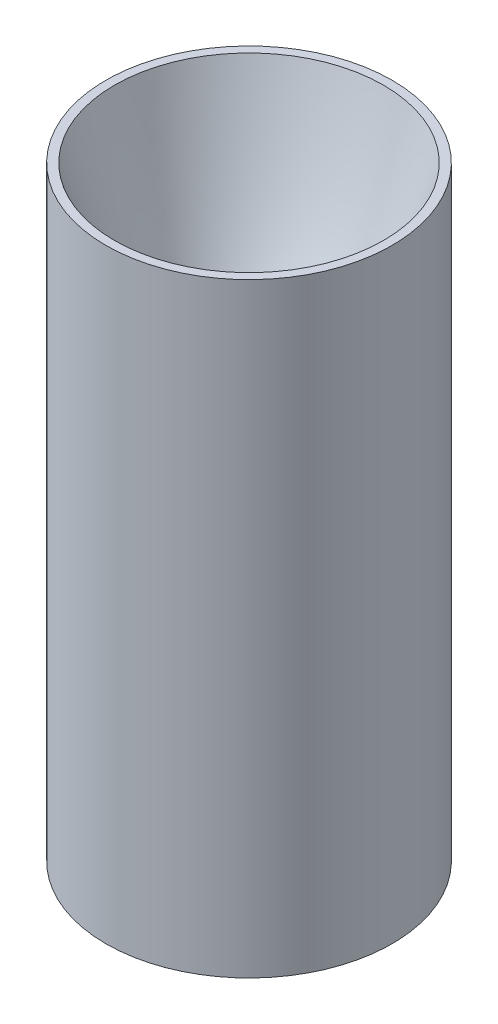
ISO-10303-21;
HEADER;
FILE_DESCRIPTION(('STEP AP214'),'2;1');
FILE_NAME('part.step','',(''),(''),'','','');
FILE_SCHEMA(('AUTOMOTIVE_DESIGN { 1 0 10303 214 1 1 1 1 }'));
ENDSEC;
DATA;
#1=APPLICATION_CONTEXT('core data for automotive mechanical design processes');
#2=APPLICATION_PROTOCOL_DEFINITION('international standard','automotive_design',2000,#1);
#3=PRODUCT_CONTEXT('',#1,'mechanical');
#4=PRODUCT('Part','Part','',(#3));
#5=PRODUCT_RELATED_PRODUCT_CATEGORY('part','',(#4));
#6=PRODUCT_DEFINITION_FORMATION('','',#4);
#7=PRODUCT_DEFINITION_CONTEXT('part definition',#1,'design');
#8=PRODUCT_DEFINITION('design','',#6,#7);
#9=PRODUCT_DEFINITION_SHAPE('','',#8);
#10=(LENGTH_UNIT() NAMED_UNIT(*) SI_UNIT(.MILLI.,.METRE.));
#11=(NAMED_UNIT(*) PLANE_ANGLE_UNIT() SI_UNIT($,.RADIAN.));
#12=(NAMED_UNIT(*) SI_UNIT($,.STERADIAN.) SOLID_ANGLE_UNIT());
#13=UNCERTAINTY_MEASURE_WITH_UNIT(LENGTH_MEASURE(1.E-05),#10,'distance_accuracy_value','');
#14=(GEOMETRIC_REPRESENTATION_CONTEXT(3) GLOBAL_UNCERTAINTY_ASSIGNED_CONTEXT((#13)) GLOBAL_UNIT_ASSIGNED_CONTEXT((#10,
#11,#12)) REPRESENTATION_CONTEXT('',''));
#15=CARTESIAN_POINT('',(0.,0.,0.));
#16=DIRECTION('',(0.,0.,1.));
#17=DIRECTION('',(1.,0.,0.));
#18=AXIS2_PLACEMENT_3D('',#15,#16,#17);
#19=CARTESIAN_POINT('',(26.7062113287053,6.50923965033825,0.));
#20=CARTESIAN_POINT('',(26.6554523867853,6.45847884124841,0.));
#21=CARTESIAN_POINT('',(26.5813741961518,6.38212177902064,0.));
#22=CARTESIAN_POINT('',(26.4154873738352,6.20864164611654,0.));
#23=CARTESIAN_POINT('',(26.2772778817675,6.04995163656635,0.));
#24=CARTESIAN_POINT('',(26.089808500155,5.83291364729743,0.));
#25=CARTESIAN_POINT('',(25.9153376003489,5.61072754276574,0.));
#26=CARTESIAN_POINT('',(25.7027203959471,5.32551893593357,0.));
#27=CARTESIAN_POINT('',(25.5134468469557,5.04570386122365,0.));
#28=CARTESIAN_POINT('',(25.3274206305271,4.75130157548285,0.));
#29=CARTESIAN_POINT('',(25.1569443484507,4.45478312275658,0.));
#30=CARTESIAN_POINT('',(24.995002426509,4.14928218433454,0.));
#31=CARTESIAN_POINT('',(24.8462181027666,3.83966673272222,0.));
#32=CARTESIAN_POINT('',(24.7081288971286,3.52362715719563,0.));
#33=CARTESIAN_POINT('',(24.5825511965105,3.20334704099946,0.));
#34=CARTESIAN_POINT('',(24.4686735390696,2.87809264472723,0.));
#35=CARTESIAN_POINT('',(24.3672556972351,2.54923942069524,0.));
#36=CARTESIAN_POINT('',(24.2780737272776,2.21635441997579,0.));
#37=CARTESIAN_POINT('',(24.2014758273978,1.88099677694374,0.));
#38=CARTESIAN_POINT('',(24.1374314313173,1.54205049780854,0.));
#39=CARTESIAN_POINT('',(24.0861168447955,1.20253727286862,0.));
#40=CARTESIAN_POINT('',(24.0523672130417,0.901433327840423,0.));
#41=CARTESIAN_POINT('',(24.0314657247247,0.646764266269616,0.));
#42=CARTESIAN_POINT('',(24.0193936938296,0.427064117093707,0.));
#43=CARTESIAN_POINT('',(24.0129558487222,0.267641069384235,0.));
#44=CARTESIAN_POINT('',(24.0105384573959,0.11011368951911,0.));
#45=CARTESIAN_POINT('',(24.0100006264442,0.0358926521759333,0.));
#46=CARTESIAN_POINT('',(24.01,1.20494413205813E-13,0.));
#47=B_SPLINE_CURVE_WITH_KNOTS('',4,(#19,#20,#21,#22,#23,#24,#25,#26,#27,#28,#29,#30,#31,#32,#33,
#34,#35,#36,#37,#38,#39,#40,#41,#42,#43,#44,#45,#46),.UNSPECIFIED.,.F.,.F.,(5,1,1,1,1,1,1,1,1,1,
1,1,1,1,1,1,1,1,1,1,1,1,1,1,5),(0.0825688161645696,0.122284452541055,0.142142270729318,
0.162000088917581,0.201715725294151,0.241431361670644,0.281146998047181,0.320862634423759,
0.360578270800262,0.400293907176806,0.440009543553384,0.479725179929891,0.519440816306429,
0.55915645268299,0.598872089059496,0.638587725436031,0.678303361812587,0.718018998189109,
0.75773463456565,0.797450270942201,0.837165907318734,0.857023725507005,0.876881543695275,
0.896739361883545,0.916597180071815),.UNSPECIFIED.);
#48=CARTESIAN_POINT('',(0.,0.,0.));
#49=DIRECTION('',(0.,1.,0.));
#50=AXIS1_PLACEMENT('',#48,#49);
#51=SURFACE_OF_REVOLUTION('',#47,#50);
#52=CARTESIAN_POINT('',(0.,-4.46648731319615E-09,0.));
#53=DIRECTION('',(0.,1.,0.));
#54=DIRECTION('',(0.,0.,1.));
#55=AXIS2_PLACEMENT_3D('',#52,#53,#54);
#56=CIRCLE('',#55,24.0100000000001);
#57=CARTESIAN_POINT('',(0.,-4.46648731319615E-09,24.0100000000001));
#58=VERTEX_POINT('',#57);
#59=EDGE_CURVE('E11',#58,#58,#56,.T.);
#60=ORIENTED_EDGE('',*,*,#59,.F.);
#61=EDGE_LOOP('',(#60));
#62=FACE_BOUND('',#61,.T.);
#63=CARTESIAN_POINT('',(0.,6.50923965033824,0.));
#64=DIRECTION('',(0.,1.,0.));
#65=DIRECTION('',(0.,0.,1.));
#66=AXIS2_PLACEMENT_3D('',#63,#64,#65);
#67=CIRCLE('',#66,26.7062113287053);
#68=CARTESIAN_POINT('',(0.,6.50923965033824,26.7062113287053));
#69=VERTEX_POINT('',#68);
#70=EDGE_CURVE('E146',#69,#69,#67,.T.);
#71=ORIENTED_EDGE('',*,*,#70,.T.);
#72=EDGE_LOOP('',(#71));
#73=FACE_BOUND('',#72,.T.);
#74=ADVANCED_FACE('F39',(#62,#73),#51,.T.);
#75=CARTESIAN_POINT('',(24.0100000000001,-4.46648731319615E-09,0.));
#76=CARTESIAN_POINT('',(24.010001230834,-0.0705286470086049,0.));
#77=CARTESIAN_POINT('',(24.0105303782523,-0.213584189636778,0.));
#78=CARTESIAN_POINT('',(24.0129060640231,-0.543182915830488,0.));
#79=CARTESIAN_POINT('',(24.0192304587046,-0.824160396557403,0.));
#80=CARTESIAN_POINT('',(24.0287155804419,-1.19482207146279,0.));
#81=CARTESIAN_POINT('',(24.0413578738196,-1.51343505805631,0.));
#82=CARTESIAN_POINT('',(24.0571580983374,-1.86193960296647,0.));
#83=CARTESIAN_POINT('',(24.0761133574244,-2.19370687149863,0.));
#84=CARTESIAN_POINT('',(24.1037509723102,-2.61806939963174,0.));
#85=CARTESIAN_POINT('',(24.1432191799184,-3.12203394653439,0.));
#86=CARTESIAN_POINT('',(24.2142318415799,-3.87997867466266,0.));
#87=CARTESIAN_POINT('',(24.3340588147198,-4.88645038796049,0.));
#88=CARTESIAN_POINT('',(24.5104181831735,-6.05671076016822,0.));
#89=CARTESIAN_POINT('',(24.7618173752155,-7.38516641466247,0.));
#90=CARTESIAN_POINT('',(25.0627274585499,-8.70357451439997,0.));
#91=CARTESIAN_POINT('',(25.4127027715297,-10.0096372085356,0.));
#92=CARTESIAN_POINT('',(25.8112931345297,-11.3018195966175,0.));
#93=CARTESIAN_POINT('',(26.2578775457228,-12.5780993348951,0.));
#94=CARTESIAN_POINT('',(26.7519354795231,-13.8368874839743,0.));
#95=CARTESIAN_POINT('',(27.2926052814547,-15.0761971287954,0.));
#96=CARTESIAN_POINT('',(27.8794115489287,-16.2946097938095,0.));
#97=CARTESIAN_POINT('',(28.5110715626963,-17.4899387939621,0.));
#98=CARTESIAN_POINT('',(29.1874645635748,-18.6612877570961,0.));
#99=CARTESIAN_POINT('',(29.906377272164,-19.805743396587,0.));
#100=CARTESIAN_POINT('',(30.6689541722521,-20.9238600748976,0.));
#101=CARTESIAN_POINT('',(31.3700993676047,-21.8744117604426,0.));
#102=CARTESIAN_POINT('',(31.9996682997863,-22.6734454806802,0.));
#103=CARTESIAN_POINT('',(32.5350605946452,-23.3204221384755,0.));
#104=CARTESIAN_POINT('',(32.9831879474879,-23.8400050167798,0.));
#105=CARTESIAN_POINT('',(33.4193822066339,-24.3298162465406,0.));
#106=CARTESIAN_POINT('',(33.8467583028501,-24.788484390126,0.));
#107=CARTESIAN_POINT('',(34.1564908220069,-25.1138683105707,0.));
#108=CARTESIAN_POINT('',(34.4477921404729,-25.4096490472126,0.));
#109=CARTESIAN_POINT('',(34.5473446086514,-25.5099499325014,0.));
#110=CARTESIAN_POINT('',(34.5972149864721,-25.5598221174983,0.));
#111=B_SPLINE_CURVE_WITH_KNOTS('',4,(#75,#76,#77,#78,#79,#80,#81,#82,#83,#84,#85,#86,#87,#88,
#89,#90,#91,#92,#93,#94,#95,#96,#97,#98,#99,#100,#101,#102,#103,#104,#105,#106,#107,#108,#109,
#110),.UNSPECIFIED.,.F.,.F.,(5,1,1,1,1,1,1,1,1,1,1,1,1,1,1,1,1,1,1,1,1,1,1,1,1,1,1,1,1,1,1,1,5),
(0.0826377293599816,0.0925749264345495,0.10251212335078,0.11244932026701,0.122386517183241,
0.132323714099471,0.142260911015702,0.152198107931932,0.162135304848163,0.182009698680624,
0.201884092513085,0.241632880178006,0.281381667842927,0.321130455507848,0.360879243172768,
0.400628030837689,0.44037681850261,0.480125606167531,0.519874393832452,0.559623181497373,
0.599371969162294,0.639120756827214,0.678869544492136,0.718618332157059,0.758367119821983,
0.798115907486907,0.817990301319368,0.837864695151829,0.857739088984291,0.877613482816753,
0.897487876649217,0.907425073565449,0.91736227032105),.UNSPECIFIED.);
#112=CARTESIAN_POINT('',(0.,0.,0.));
#113=DIRECTION('',(0.,1.,0.));
#114=AXIS1_PLACEMENT('',#112,#113);
#115=SURFACE_OF_REVOLUTION('',#111,#114);
#116=CARTESIAN_POINT('',(0.,-25.5598221143495,0.));
#117=DIRECTION('',(0.,1.,0.));
#118=DIRECTION('',(0.,0.,1.));
#119=AXIS2_PLACEMENT_3D('',#116,#117,#118);
#120=CIRCLE('',#119,34.5972149832909);
#121=CARTESIAN_POINT('',(0.,-25.5598221143495,34.5972149832909));
#122=VERTEX_POINT('',#121);
#123=EDGE_CURVE('E47',#122,#122,#120,.T.);
#124=ORIENTED_EDGE('',*,*,#123,.F.);
#125=EDGE_LOOP('',(#124));
#126=FACE_BOUND('',#125,.T.);
#127=ORIENTED_EDGE('',*,*,#59,.T.);
#128=EDGE_LOOP('',(#127));
#129=FACE_BOUND('',#128,.T.);
#130=ADVANCED_FACE('F165',(#126,#129),#115,.T.);
#131=CARTESIAN_POINT('',(0.,-25.5598221143495,0.));
#132=DIRECTION('',(0.,-1.,0.));
#133=DIRECTION('',(0.,0.,-1.));
#134=AXIS2_PLACEMENT_3D('',#131,#132,#133);
#135=CONICAL_SURFACE('',#134,34.5972149832909,0.785398163436918);
#136=CARTESIAN_POINT('',(0.,-34.1674503024594,0.));
#137=DIRECTION('',(0.,1.,0.));
#138=DIRECTION('',(0.,0.,1.));
#139=AXIS2_PLACEMENT_3D('',#136,#137,#138);
#140=CIRCLE('',#139,43.2048431720803);
#141=CARTESIAN_POINT('',(0.,-34.1674503024594,43.2048431720803));
#142=VERTEX_POINT('',#141);
#143=EDGE_CURVE('E223',#142,#142,#140,.T.);
#144=ORIENTED_EDGE('',*,*,#143,.F.);
#145=EDGE_LOOP('',(#144));
#146=FACE_BOUND('',#145,.T.);
#147=ORIENTED_EDGE('',*,*,#123,.T.);
#148=EDGE_LOOP('',(#147));
#149=FACE_BOUND('',#148,.T.);
#150=ADVANCED_FACE('F168',(#146,#149),#135,.F.);
#151=CARTESIAN_POINT('',(43.2048431720803,-34.1674503024594,0.));
#152=CARTESIAN_POINT('',(43.2547153316162,-34.2173227006972,0.));
#153=CARTESIAN_POINT('',(43.3553242540962,-34.3186769321328,0.));
#154=CARTESIAN_POINT('',(43.5850045903309,-34.5517100929211,0.));
#155=CARTESIAN_POINT('',(43.7848568102303,-34.7605007911668,0.));
#156=CARTESIAN_POINT('',(44.0923896922468,-35.084791821967,0.));
#157=CARTESIAN_POINT('',(44.4257083828646,-35.4471532905378,0.));
#158=CARTESIAN_POINT('',(44.8260591459288,-35.8944082618106,0.));
#159=CARTESIAN_POINT('',(45.2637498835705,-36.403541906738,0.));
#160=CARTESIAN_POINT('',(45.8044701470812,-37.0558327415349,0.));
#161=CARTESIAN_POINT('',(46.4308012784225,-37.8516123975977,0.));
#162=CARTESIAN_POINT('',(47.1340343659634,-38.8042368443219,0.));
#163=CARTESIAN_POINT('',(47.8954077591865,-39.9211332544567,0.));
#164=CARTESIAN_POINT('',(48.6150574802605,-41.0663154687782,0.));
#165=CARTESIAN_POINT('',(49.2910524941577,-42.2372538217737,0.));
#166=CARTESIAN_POINT('',(49.9229932037626,-43.4328621021398,0.));
#167=CARTESIAN_POINT('',(50.5096660412486,-44.6511293737381,0.));
#168=CARTESIAN_POINT('',(51.050452662479,-45.8905689699365,0.));
#169=CARTESIAN_POINT('',(51.5444701455753,-47.1492956265149,0.));
#170=CARTESIAN_POINT('',(51.9352810654396,-48.2661297790053,0.));
#171=CARTESIAN_POINT('',(52.2402216765641,-49.2332382924044,0.));
#172=CARTESIAN_POINT('',(52.5209465707137,-50.207649587483,0.));
#173=CARTESIAN_POINT('',(52.7773074768637,-51.1886996300122,0.));
#174=CARTESIAN_POINT('',(53.0029965537757,-52.1776033655984,0.));
#175=CARTESIAN_POINT('',(53.1977431994108,-53.1725857820378,0.));
#176=CARTESIAN_POINT('',(53.3676081739292,-54.1725959707137,0.));
#177=CARTESIAN_POINT('',(53.4883592576744,-55.0083263996009,0.));
#178=CARTESIAN_POINT('',(53.5882208567579,-55.8486409039841,0.));
#179=CARTESIAN_POINT('',(53.6671255351866,-56.6881587025245,0.));
#180=CARTESIAN_POINT('',(53.7113377045683,-57.2811204360298,0.));
#181=CARTESIAN_POINT('',(53.7413500507298,-57.7817549792337,0.));
#182=CARTESIAN_POINT('',(53.7611008829948,-58.2129981581102,0.));
#183=CARTESIAN_POINT('',(53.7737437838757,-58.5327280239111,0.));
#184=CARTESIAN_POINT('',(53.7832292748185,-58.9049560288033,0.));
#185=CARTESIAN_POINT('',(53.7895538765542,-59.1817251525144,0.));
#186=CARTESIAN_POINT('',(53.7919297303013,-59.5155666389604,0.));
#187=CARTESIAN_POINT('',(53.7924588747393,-59.6571436926105,0.));
#188=CARTESIAN_POINT('',(53.7924601068197,-59.7276737457881,0.));
#189=B_SPLINE_CURVE_WITH_KNOTS('',4,(#151,#152,#153,#154,#155,#156,#157,#158,#159,#160,#161,
#162,#163,#164,#165,#166,#167,#168,#169,#170,#171,#172,#173,#174,#175,#176,#177,#178,#179,#180,
#181,#182,#183,#184,#185,#186,#187,#188),.UNSPECIFIED.,.F.,.F.,(5,1,1,1,1,1,1,1,1,1,1,1,1,1,1,1,
1,1,1,1,1,1,1,1,1,1,1,1,1,1,1,1,1,1,5),(0.0826377289384845,0.0925749252793734,0.102512122195606,
0.112449319111838,0.12238651602807,0.142260909860531,0.162135303692992,0.182009697525453,
0.201884091357913,0.241632879022835,0.281381666687757,0.321130454352678,0.3608792420176,
0.400628029682522,0.440376817347443,0.480125605012365,0.519874392677286,0.559623180342207,
0.599371968007128,0.619246361839589,0.639120755672051,0.678869543336972,0.718618331001893,
0.738492724834354,0.758367118666815,0.798115906331736,0.817990300164197,0.837864693996658,
0.857739087829119,0.867676284745349,0.87761348166158,0.88755067857781,0.897487875494041,
0.907425072410271,0.917362269906334),.UNSPECIFIED.);
#190=CARTESIAN_POINT('',(0.,0.,0.));
#191=DIRECTION('',(0.,1.,0.));
#192=AXIS1_PLACEMENT('',#190,#191);
#193=SURFACE_OF_REVOLUTION('',#189,#192);
#194=CARTESIAN_POINT('',(0.,-59.7276737621414,0.));
#195=DIRECTION('',(0.,1.,0.));
#196=DIRECTION('',(0.,0.,1.));
#197=AXIS2_PLACEMENT_3D('',#194,#195,#196);
#198=CIRCLE('',#197,53.79246010682);
#199=CARTESIAN_POINT('',(0.,-59.7276737621414,53.79246010682));
#200=VERTEX_POINT('',#199);
#201=EDGE_CURVE('E220',#200,#200,#198,.T.);
#202=ORIENTED_EDGE('',*,*,#201,.F.);
#203=EDGE_LOOP('',(#202));
#204=FACE_BOUND('',#203,.T.);
#205=ORIENTED_EDGE('',*,*,#143,.T.);
#206=EDGE_LOOP('',(#205));
#207=FACE_BOUND('',#206,.T.);
#208=ADVANCED_FACE('F172',(#204,#207),#193,.T.);
#209=CARTESIAN_POINT('',(0.,0.,0.));
#210=DIRECTION('',(0.,1.,0.));
#211=DIRECTION('',(0.,0.,1.));
#212=AXIS2_PLACEMENT_3D('',#209,#210,#211);
#213=CYLINDRICAL_SURFACE('',#212,53.7924601068201);
#214=CARTESIAN_POINT('',(0.,-212.127673762141,0.));
#215=DIRECTION('',(0.,1.,0.));
#216=DIRECTION('',(0.,0.,1.));
#217=AXIS2_PLACEMENT_3D('',#214,#215,#216);
#218=CIRCLE('',#217,53.7924601068201);
#219=CARTESIAN_POINT('',(0.,-212.127673762141,53.7924601068201));
#220=VERTEX_POINT('',#219);
#221=EDGE_CURVE('E217',#220,#220,#218,.T.);
#222=ORIENTED_EDGE('',*,*,#221,.F.);
#223=EDGE_LOOP('',(#222));
#224=FACE_BOUND('',#223,.T.);
#225=ORIENTED_EDGE('',*,*,#201,.T.);
#226=EDGE_LOOP('',(#225));
#227=FACE_BOUND('',#226,.T.);
#228=ADVANCED_FACE('F176',(#224,#227),#213,.F.);
#229=CARTESIAN_POINT('',(76.2,-212.127673762141,0.));
#230=DIRECTION('',(0.,1.,0.));
#231=DIRECTION('',(0.,0.,1.));
#232=AXIS2_PLACEMENT_3D('',#229,#230,#231);
#233=PLANE('',#232);
#234=CARTESIAN_POINT('',(-61.59966783019,-212.127673762141,25.5154178529424));
#235=DIRECTION('',(0.,-1.,0.));
#236=DIRECTION('',(0.,0.,-1.));
#237=AXIS2_PLACEMENT_3D('',#234,#235,#236);
#238=CIRCLE('',#237,3.17499999999999);
#239=CARTESIAN_POINT('',(-61.59966783019,-212.127673762141,22.3404178529424));
#240=VERTEX_POINT('',#239);
#241=EDGE_CURVE('E89',#240,#240,#238,.T.);
#242=ORIENTED_EDGE('',*,*,#241,.F.);
#243=EDGE_LOOP('',(#242));
#244=FACE_BOUND('',#243,.T.);
#245=CARTESIAN_POINT('',(61.59966783019,-212.127673762141,-25.5154178529424));
#246=DIRECTION('',(0.,-1.,0.));
#247=DIRECTION('',(0.,0.,-1.));
#248=AXIS2_PLACEMENT_3D('',#245,#246,#247);
#249=CIRCLE('',#248,3.17499999999998);
#250=CARTESIAN_POINT('',(61.59966783019,-212.127673762141,-28.6904178529424));
#251=VERTEX_POINT('',#250);
#252=EDGE_CURVE('E88',#251,#251,#249,.T.);
#253=ORIENTED_EDGE('',*,*,#252,.F.);
#254=EDGE_LOOP('',(#253));
#255=FACE_BOUND('',#254,.T.);
#256=CARTESIAN_POINT('',(47.1463446356136,-212.127673762141,47.1463446356125));
#257=DIRECTION('',(0.,-1.,0.));
#258=DIRECTION('',(0.,0.,-1.));
#259=AXIS2_PLACEMENT_3D('',#256,#257,#258);
#260=CIRCLE('',#259,4.21639999999999);
#261=CARTESIAN_POINT('',(47.1463446356136,-212.127673762141,42.9299446356125));
#262=VERTEX_POINT('',#261);
#263=EDGE_CURVE('E99',#262,#262,#260,.T.);
#264=ORIENTED_EDGE('',*,*,#263,.F.);
#265=EDGE_LOOP('',(#264));
#266=FACE_BOUND('',#265,.T.);
#267=CARTESIAN_POINT('',(6.98383554802098E-13,-212.127673762141,66.675));
#268=DIRECTION('',(0.,-1.,0.));
#269=DIRECTION('',(0.,0.,-1.));
#270=AXIS2_PLACEMENT_3D('',#267,#268,#269);
#271=CIRCLE('',#270,4.21639999999999);
#272=CARTESIAN_POINT('',(6.98383554802098E-13,-212.127673762141,62.4586));
#273=VERTEX_POINT('',#272);
#274=EDGE_CURVE('E105',#273,#273,#271,.T.);
#275=ORIENTED_EDGE('',*,*,#274,.F.);
#276=EDGE_LOOP('',(#275));
#277=FACE_BOUND('',#276,.T.);
#278=CARTESIAN_POINT('',(-47.1463446356126,-212.127673762141,47.1463446356135));
#279=DIRECTION('',(0.,-1.,0.));
#280=DIRECTION('',(0.,0.,-1.));
#281=AXIS2_PLACEMENT_3D('',#278,#279,#280);
#282=CIRCLE('',#281,4.21639999999999);
#283=CARTESIAN_POINT('',(-47.1463446356126,-212.127673762141,42.9299446356135));
#284=VERTEX_POINT('',#283);
#285=EDGE_CURVE('E111',#284,#284,#282,.T.);
#286=ORIENTED_EDGE('',*,*,#285,.F.);
#287=EDGE_LOOP('',(#286));
#288=FACE_BOUND('',#287,.T.);
#289=CARTESIAN_POINT('',(-66.675,-212.127673762141,0.));
#290=DIRECTION('',(0.,-1.,0.));
#291=DIRECTION('',(0.,0.,-1.));
#292=AXIS2_PLACEMENT_3D('',#289,#290,#291);
#293=CIRCLE('',#292,4.21639999999999);
#294=CARTESIAN_POINT('',(-66.675,-212.127673762141,-4.21639999999999));
#295=VERTEX_POINT('',#294);
#296=EDGE_CURVE('E117',#295,#295,#293,.T.);
#297=ORIENTED_EDGE('',*,*,#296,.F.);
#298=EDGE_LOOP('',(#297));
#299=FACE_BOUND('',#298,.T.);
#300=CARTESIAN_POINT('',(-47.1463446356133,-212.127673762141,-47.1463446356128));
#301=DIRECTION('',(0.,-1.,0.));
#302=DIRECTION('',(0.,0.,-1.));
#303=AXIS2_PLACEMENT_3D('',#300,#301,#302);
#304=CIRCLE('',#303,4.21639999999999);
#305=CARTESIAN_POINT('',(-47.1463446356133,-212.127673762141,-51.3627446356128));
#306=VERTEX_POINT('',#305);
#307=EDGE_CURVE('E123',#306,#306,#304,.T.);
#308=ORIENTED_EDGE('',*,*,#307,.F.);
#309=EDGE_LOOP('',(#308));
#310=FACE_BOUND('',#309,.T.);
#311=CARTESIAN_POINT('',(-2.32794518267366E-13,-212.127673762141,-66.675));
#312=DIRECTION('',(0.,-1.,0.));
#313=DIRECTION('',(0.,0.,-1.));
#314=AXIS2_PLACEMENT_3D('',#311,#312,#313);
#315=CIRCLE('',#314,4.21639999999999);
#316=CARTESIAN_POINT('',(-2.32794518267366E-13,-212.127673762141,-70.8914));
#317=VERTEX_POINT('',#316);
#318=EDGE_CURVE('E129',#317,#317,#315,.T.);
#319=ORIENTED_EDGE('',*,*,#318,.F.);
#320=EDGE_LOOP('',(#319));
#321=FACE_BOUND('',#320,.T.);
#322=CARTESIAN_POINT('',(47.146344635613,-212.127673762141,-47.1463446356132));
#323=DIRECTION('',(0.,-1.,0.));
#324=DIRECTION('',(0.,0.,-1.));
#325=AXIS2_PLACEMENT_3D('',#322,#323,#324);
#326=CIRCLE('',#325,4.21639999999999);
#327=CARTESIAN_POINT('',(47.146344635613,-212.127673762141,-51.3627446356131));
#328=VERTEX_POINT('',#327);
#329=EDGE_CURVE('E135',#328,#328,#326,.T.);
#330=ORIENTED_EDGE('',*,*,#329,.F.);
#331=EDGE_LOOP('',(#330));
#332=FACE_BOUND('',#331,.T.);
#333=CARTESIAN_POINT('',(66.675,-212.127673762141,0.));
#334=DIRECTION('',(0.,-1.,0.));
#335=DIRECTION('',(0.,0.,-1.));
#336=AXIS2_PLACEMENT_3D('',#333,#334,#335);
#337=CIRCLE('',#336,4.21639999999999);
#338=CARTESIAN_POINT('',(66.675,-212.127673762141,-4.21639999999999));
#339=VERTEX_POINT('',#338);
#340=EDGE_CURVE('E141',#339,#339,#337,.T.);
#341=ORIENTED_EDGE('',*,*,#340,.F.);
#342=EDGE_LOOP('',(#341));
#343=FACE_BOUND('',#342,.T.);
#344=CARTESIAN_POINT('',(0.,-212.127673762141,0.));
#345=DIRECTION('',(0.,1.,0.));
#346=DIRECTION('',(0.,0.,1.));
#347=AXIS2_PLACEMENT_3D('',#344,#345,#346);
#348=CIRCLE('',#347,76.2);
#349=CARTESIAN_POINT('',(0.,-212.127673762141,76.2));
#350=VERTEX_POINT('',#349);
#351=EDGE_CURVE('E214',#350,#350,#348,.T.);
#352=ORIENTED_EDGE('',*,*,#351,.F.);
#353=EDGE_LOOP('',(#352));
#354=FACE_BOUND('',#353,.T.);
#355=ORIENTED_EDGE('',*,*,#221,.T.);
#356=EDGE_LOOP('',(#355));
#357=FACE_BOUND('',#356,.T.);
#358=ADVANCED_FACE('F180',(#244,#255,#266,#277,#288,#299,#310,#321,#332,#343,#354,#357),#233,.F.);
#359=CARTESIAN_POINT('',(0.,0.,0.));
#360=DIRECTION('',(0.,1.,0.));
#361=DIRECTION('',(0.,0.,1.));
#362=AXIS2_PLACEMENT_3D('',#359,#360,#361);
#363=CYLINDRICAL_SURFACE('',#362,76.2);
#364=CARTESIAN_POINT('',(0.,109.927347076635,0.));
#365=DIRECTION('',(0.,1.,0.));
#366=DIRECTION('',(0.,0.,1.));
#367=AXIS2_PLACEMENT_3D('',#364,#365,#366);
#368=CIRCLE('',#367,76.2);
#369=CARTESIAN_POINT('',(0.,109.927347076635,76.2));
#370=VERTEX_POINT('',#369);
#371=EDGE_CURVE('E211',#370,#370,#368,.T.);
#372=ORIENTED_EDGE('',*,*,#371,.F.);
#373=EDGE_LOOP('',(#372));
#374=FACE_BOUND('',#373,.T.);
#375=ORIENTED_EDGE('',*,*,#351,.T.);
#376=EDGE_LOOP('',(#375));
#377=FACE_BOUND('',#376,.T.);
#378=ADVANCED_FACE('F184',(#374,#377),#363,.T.);
#379=CARTESIAN_POINT('',(71.6384554787615,109.927347076635,0.));
#380=DIRECTION('',(0.,-1.,0.));
#381=DIRECTION('',(0.,0.,-1.));
#382=AXIS2_PLACEMENT_3D('',#379,#380,#381);
#383=PLANE('',#382);
#384=CARTESIAN_POINT('',(0.,109.927347076635,0.));
#385=DIRECTION('',(0.,1.,0.));
#386=DIRECTION('',(0.,0.,1.));
#387=AXIS2_PLACEMENT_3D('',#384,#385,#386);
#388=CIRCLE('',#387,71.6384554787615);
#389=CARTESIAN_POINT('',(0.,109.927347076635,71.6384554787615));
#390=VERTEX_POINT('',#389);
#391=EDGE_CURVE('E208',#390,#390,#388,.T.);
#392=ORIENTED_EDGE('',*,*,#391,.F.);
#393=EDGE_LOOP('',(#392));
#394=FACE_BOUND('',#393,.T.);
#395=ORIENTED_EDGE('',*,*,#371,.T.);
#396=EDGE_LOOP('',(#395));
#397=FACE_BOUND('',#396,.T.);
#398=ADVANCED_FACE('F188',(#394,#397),#383,.F.);
#399=CARTESIAN_POINT('',(71.6384554787615,109.927347076635,0.));
#400=CARTESIAN_POINT('',(49.1723334607279,34.6359542236987,0.));
#401=CARTESIAN_POINT('',(26.7062113287053,6.50923965033824,0.));
#402=B_SPLINE_CURVE_WITH_KNOTS('',2,(#399,#400,#401),.UNSPECIFIED.,.F.,.F.,(3,3),(0.,1.),.UNSPECIFIED.);
#403=CARTESIAN_POINT('',(0.,0.,0.));
#404=DIRECTION('',(0.,1.,0.));
#405=AXIS1_PLACEMENT('',#403,#404);
#406=SURFACE_OF_REVOLUTION('',#402,#405);
#407=ORIENTED_EDGE('',*,*,#70,.F.);
#408=EDGE_LOOP('',(#407));
#409=FACE_BOUND('',#408,.T.);
#410=ORIENTED_EDGE('',*,*,#391,.T.);
#411=EDGE_LOOP('',(#410));
#412=FACE_BOUND('',#411,.T.);
#413=ADVANCED_FACE('F192',(#409,#412),#406,.T.);
#414=CARTESIAN_POINT('',(66.675,-187.126453762141,0.));
#415=DIRECTION('',(0.,-1.,0.));
#416=DIRECTION('',(0.,0.,-1.));
#417=AXIS2_PLACEMENT_3D('',#414,#415,#416);
#418=CONICAL_SURFACE('',#417,4.21639999999999,1.02974425867665);
#419=CARTESIAN_POINT('',(66.675,-184.592985048074,0.));
#420=VERTEX_POINT('',#419);
#421=VERTEX_LOOP('',#420);
#422=FACE_BOUND('',#421,.T.);
#423=CARTESIAN_POINT('',(66.675,-187.126453762141,0.));
#424=DIRECTION('',(0.,-1.,0.));
#425=DIRECTION('',(0.,0.,-1.));
#426=AXIS2_PLACEMENT_3D('',#423,#424,#425);
#427=CIRCLE('',#426,4.21639999999999);
#428=CARTESIAN_POINT('',(66.675,-187.126453762141,-4.21639999999999));
#429=VERTEX_POINT('',#428);
#430=EDGE_CURVE('E144',#429,#429,#427,.T.);
#431=ORIENTED_EDGE('',*,*,#430,.T.);
#432=EDGE_LOOP('',(#431));
#433=FACE_BOUND('',#432,.T.);
#434=ADVANCED_FACE('F196',(#422,#433),#418,.F.);
#435=CARTESIAN_POINT('',(66.675,-212.127673762141,0.));
#436=DIRECTION('',(0.,-1.,0.));
#437=DIRECTION('',(0.,0.,-1.));
#438=AXIS2_PLACEMENT_3D('',#435,#436,#437);
#439=CYLINDRICAL_SURFACE('',#438,4.21639999999999);
#440=ORIENTED_EDGE('',*,*,#430,.F.);
#441=EDGE_LOOP('',(#440));
#442=FACE_BOUND('',#441,.T.);
#443=ORIENTED_EDGE('',*,*,#340,.T.);
#444=EDGE_LOOP('',(#443));
#445=FACE_BOUND('',#444,.T.);
#446=ADVANCED_FACE('F289',(#442,#445),#439,.F.);
#447=CARTESIAN_POINT('',(47.146344635613,-187.126453762141,-47.1463446356132));
#448=DIRECTION('',(0.,-1.,0.));
#449=DIRECTION('',(0.,0.,-1.));
#450=AXIS2_PLACEMENT_3D('',#447,#448,#449);
#451=CONICAL_SURFACE('',#450,4.21639999999999,1.02974425867665);
#452=CARTESIAN_POINT('',(47.146344635613,-184.592985048074,-47.1463446356132));
#453=VERTEX_POINT('',#452);
#454=VERTEX_LOOP('',#453);
#455=FACE_BOUND('',#454,.T.);
#456=CARTESIAN_POINT('',(47.146344635613,-187.126453762141,-47.1463446356132));
#457=DIRECTION('',(0.,-1.,0.));
#458=DIRECTION('',(0.,0.,-1.));
#459=AXIS2_PLACEMENT_3D('',#456,#457,#458);
#460=CIRCLE('',#459,4.21639999999999);
#461=CARTESIAN_POINT('',(47.146344635613,-187.126453762141,-51.3627446356131));
#462=VERTEX_POINT('',#461);
#463=EDGE_CURVE('E138',#462,#462,#460,.T.);
#464=ORIENTED_EDGE('',*,*,#463,.T.);
#465=EDGE_LOOP('',(#464));
#466=FACE_BOUND('',#465,.T.);
#467=ADVANCED_FACE('F296',(#455,#466),#451,.F.);
#468=CARTESIAN_POINT('',(47.146344635613,-212.127673762141,-47.1463446356132));
#469=DIRECTION('',(0.,-1.,0.));
#470=DIRECTION('',(0.,0.,-1.));
#471=AXIS2_PLACEMENT_3D('',#468,#469,#470);
#472=CYLINDRICAL_SURFACE('',#471,4.21639999999999);
#473=ORIENTED_EDGE('',*,*,#463,.F.);
#474=EDGE_LOOP('',(#473));
#475=FACE_BOUND('',#474,.T.);
#476=ORIENTED_EDGE('',*,*,#329,.T.);
#477=EDGE_LOOP('',(#476));
#478=FACE_BOUND('',#477,.T.);
#479=ADVANCED_FACE('F304',(#475,#478),#472,.F.);
#480=CARTESIAN_POINT('',(-2.32794518267366E-13,-187.126453762141,-66.675));
#481=DIRECTION('',(0.,-1.,0.));
#482=DIRECTION('',(0.,0.,-1.));
#483=AXIS2_PLACEMENT_3D('',#480,#481,#482);
#484=CONICAL_SURFACE('',#483,4.21639999999999,1.02974425867665);
#485=CARTESIAN_POINT('',(-2.39538571947206E-13,-184.592985048074,-66.675));
#486=VERTEX_POINT('',#485);
#487=VERTEX_LOOP('',#486);
#488=FACE_BOUND('',#487,.T.);
#489=CARTESIAN_POINT('',(-2.32794518267366E-13,-187.126453762141,-66.675));
#490=DIRECTION('',(0.,-1.,0.));
#491=DIRECTION('',(0.,0.,-1.));
#492=AXIS2_PLACEMENT_3D('',#489,#490,#491);
#493=CIRCLE('',#492,4.21639999999999);
#494=CARTESIAN_POINT('',(-2.32794518267366E-13,-187.126453762141,-70.8914));
#495=VERTEX_POINT('',#494);
#496=EDGE_CURVE('E132',#495,#495,#493,.T.);
#497=ORIENTED_EDGE('',*,*,#496,.T.);
#498=EDGE_LOOP('',(#497));
#499=FACE_BOUND('',#498,.T.);
#500=ADVANCED_FACE('F312',(#488,#499),#484,.F.);
#501=CARTESIAN_POINT('',(-2.32794518267366E-13,-212.127673762141,-66.675));
#502=DIRECTION('',(0.,-1.,0.));
#503=DIRECTION('',(0.,0.,-1.));
#504=AXIS2_PLACEMENT_3D('',#501,#502,#503);
#505=CYLINDRICAL_SURFACE('',#504,4.21639999999999);
#506=ORIENTED_EDGE('',*,*,#496,.F.);
#507=EDGE_LOOP('',(#506));
#508=FACE_BOUND('',#507,.T.);
#509=ORIENTED_EDGE('',*,*,#318,.T.);
#510=EDGE_LOOP('',(#509));
#511=FACE_BOUND('',#510,.T.);
#512=ADVANCED_FACE('F321',(#508,#511),#505,.F.);
#513=CARTESIAN_POINT('',(-47.1463446356133,-187.126453762141,-47.1463446356128));
#514=DIRECTION('',(0.,-1.,0.));
#515=DIRECTION('',(0.,0.,-1.));
#516=AXIS2_PLACEMENT_3D('',#513,#514,#515);
#517=CONICAL_SURFACE('',#516,4.21639999999999,1.02974425867665);
#518=CARTESIAN_POINT('',(-47.1463446356133,-184.592985048074,-47.1463446356128));
#519=VERTEX_POINT('',#518);
#520=VERTEX_LOOP('',#519);
#521=FACE_BOUND('',#520,.T.);
#522=CARTESIAN_POINT('',(-47.1463446356133,-187.126453762141,-47.1463446356128));
#523=DIRECTION('',(0.,-1.,0.));
#524=DIRECTION('',(0.,0.,-1.));
#525=AXIS2_PLACEMENT_3D('',#522,#523,#524);
#526=CIRCLE('',#525,4.21639999999999);
#527=CARTESIAN_POINT('',(-47.1463446356133,-187.126453762141,-51.3627446356128));
#528=VERTEX_POINT('',#527);
#529=EDGE_CURVE('E126',#528,#528,#526,.T.);
#530=ORIENTED_EDGE('',*,*,#529,.T.);
#531=EDGE_LOOP('',(#530));
#532=FACE_BOUND('',#531,.T.);
#533=ADVANCED_FACE('F330',(#521,#532),#517,.F.);
#534=CARTESIAN_POINT('',(-47.1463446356133,-212.127673762141,-47.1463446356128));
#535=DIRECTION('',(0.,-1.,0.));
#536=DIRECTION('',(0.,0.,-1.));
#537=AXIS2_PLACEMENT_3D('',#534,#535,#536);
#538=CYLINDRICAL_SURFACE('',#537,4.21639999999999);
#539=ORIENTED_EDGE('',*,*,#529,.F.);
#540=EDGE_LOOP('',(#539));
#541=FACE_BOUND('',#540,.T.);
#542=ORIENTED_EDGE('',*,*,#307,.T.);
#543=EDGE_LOOP('',(#542));
#544=FACE_BOUND('',#543,.T.);
#545=ADVANCED_FACE('F340',(#541,#544),#538,.F.);
#546=CARTESIAN_POINT('',(-66.675,-187.126453762141,0.));
#547=DIRECTION('',(0.,-1.,0.));
#548=DIRECTION('',(0.,0.,-1.));
#549=AXIS2_PLACEMENT_3D('',#546,#547,#548);
#550=CONICAL_SURFACE('',#549,4.21639999999999,1.02974425867665);
#551=CARTESIAN_POINT('',(-66.675,-184.592985048074,0.));
#552=VERTEX_POINT('',#551);
#553=VERTEX_LOOP('',#552);
#554=FACE_BOUND('',#553,.T.);
#555=CARTESIAN_POINT('',(-66.675,-187.126453762141,0.));
#556=DIRECTION('',(0.,-1.,0.));
#557=DIRECTION('',(0.,0.,-1.));
#558=AXIS2_PLACEMENT_3D('',#555,#556,#557);
#559=CIRCLE('',#558,4.21639999999999);
#560=CARTESIAN_POINT('',(-66.675,-187.126453762141,-4.21639999999999));
#561=VERTEX_POINT('',#560);
#562=EDGE_CURVE('E120',#561,#561,#559,.T.);
#563=ORIENTED_EDGE('',*,*,#562,.T.);
#564=EDGE_LOOP('',(#563));
#565=FACE_BOUND('',#564,.T.);
#566=ADVANCED_FACE('F348',(#554,#565),#550,.F.);
#567=CARTESIAN_POINT('',(-66.675,-212.127673762141,0.));
#568=DIRECTION('',(0.,-1.,0.));
#569=DIRECTION('',(0.,0.,-1.));
#570=AXIS2_PLACEMENT_3D('',#567,#568,#569);
#571=CYLINDRICAL_SURFACE('',#570,4.21639999999999);
#572=ORIENTED_EDGE('',*,*,#562,.F.);
#573=EDGE_LOOP('',(#572));
#574=FACE_BOUND('',#573,.T.);
#575=ORIENTED_EDGE('',*,*,#296,.T.);
#576=EDGE_LOOP('',(#575));
#577=FACE_BOUND('',#576,.T.);
#578=ADVANCED_FACE('F357',(#574,#577),#571,.F.);
#579=CARTESIAN_POINT('',(-47.1463446356126,-187.126453762141,47.1463446356135));
#580=DIRECTION('',(0.,-1.,0.));
#581=DIRECTION('',(0.,0.,-1.));
#582=AXIS2_PLACEMENT_3D('',#579,#580,#581);
#583=CONICAL_SURFACE('',#582,4.21639999999999,1.02974425867665);
#584=CARTESIAN_POINT('',(-47.1463446356127,-184.592985048074,47.1463446356135));
#585=VERTEX_POINT('',#584);
#586=VERTEX_LOOP('',#585);
#587=FACE_BOUND('',#586,.T.);
#588=CARTESIAN_POINT('',(-47.1463446356126,-187.126453762141,47.1463446356135));
#589=DIRECTION('',(0.,-1.,0.));
#590=DIRECTION('',(0.,0.,-1.));
#591=AXIS2_PLACEMENT_3D('',#588,#589,#590);
#592=CIRCLE('',#591,4.21639999999999);
#593=CARTESIAN_POINT('',(-47.1463446356126,-187.126453762141,42.9299446356135));
#594=VERTEX_POINT('',#593);
#595=EDGE_CURVE('E114',#594,#594,#592,.T.);
#596=ORIENTED_EDGE('',*,*,#595,.T.);
#597=EDGE_LOOP('',(#596));
#598=FACE_BOUND('',#597,.T.);
#599=ADVANCED_FACE('F365',(#587,#598),#583,.F.);
#600=CARTESIAN_POINT('',(-47.1463446356126,-212.127673762141,47.1463446356135));
#601=DIRECTION('',(0.,-1.,0.));
#602=DIRECTION('',(0.,0.,-1.));
#603=AXIS2_PLACEMENT_3D('',#600,#601,#602);
#604=CYLINDRICAL_SURFACE('',#603,4.21639999999999);
#605=ORIENTED_EDGE('',*,*,#595,.F.);
#606=EDGE_LOOP('',(#605));
#607=FACE_BOUND('',#606,.T.);
#608=ORIENTED_EDGE('',*,*,#285,.T.);
#609=EDGE_LOOP('',(#608));
#610=FACE_BOUND('',#609,.T.);
#611=ADVANCED_FACE('F374',(#607,#610),#604,.F.);
#612=CARTESIAN_POINT('',(6.98383554802098E-13,-187.126453762141,66.675));
#613=DIRECTION('',(0.,-1.,0.));
#614=DIRECTION('',(0.,0.,-1.));
#615=AXIS2_PLACEMENT_3D('',#612,#613,#614);
#616=CONICAL_SURFACE('',#615,4.21639999999999,1.02974425867665);
#617=CARTESIAN_POINT('',(6.91639501122257E-13,-184.592985048074,66.675));
#618=VERTEX_POINT('',#617);
#619=VERTEX_LOOP('',#618);
#620=FACE_BOUND('',#619,.T.);
#621=CARTESIAN_POINT('',(6.98383554802098E-13,-187.126453762141,66.675));
#622=DIRECTION('',(0.,-1.,0.));
#623=DIRECTION('',(0.,0.,-1.));
#624=AXIS2_PLACEMENT_3D('',#621,#622,#623);
#625=CIRCLE('',#624,4.21639999999999);
#626=CARTESIAN_POINT('',(6.98383554802098E-13,-187.126453762141,62.4586));
#627=VERTEX_POINT('',#626);
#628=EDGE_CURVE('E108',#627,#627,#625,.T.);
#629=ORIENTED_EDGE('',*,*,#628,.T.);
#630=EDGE_LOOP('',(#629));
#631=FACE_BOUND('',#630,.T.);
#632=ADVANCED_FACE('F382',(#620,#631),#616,.F.);
#633=CARTESIAN_POINT('',(6.98383554802098E-13,-212.127673762141,66.675));
#634=DIRECTION('',(0.,-1.,0.));
#635=DIRECTION('',(0.,0.,-1.));
#636=AXIS2_PLACEMENT_3D('',#633,#634,#635);
#637=CYLINDRICAL_SURFACE('',#636,4.21639999999999);
#638=ORIENTED_EDGE('',*,*,#628,.F.);
#639=EDGE_LOOP('',(#638));
#640=FACE_BOUND('',#639,.T.);
#641=ORIENTED_EDGE('',*,*,#274,.T.);
#642=EDGE_LOOP('',(#641));
#643=FACE_BOUND('',#642,.T.);
#644=ADVANCED_FACE('F391',(#640,#643),#637,.F.);
#645=CARTESIAN_POINT('',(47.1463446356136,-187.126453762141,47.1463446356125));
#646=DIRECTION('',(0.,-1.,0.));
#647=DIRECTION('',(0.,0.,-1.));
#648=AXIS2_PLACEMENT_3D('',#645,#646,#647);
#649=CONICAL_SURFACE('',#648,4.21639999999999,1.02974425867665);
#650=CARTESIAN_POINT('',(47.1463446356136,-184.592985048074,47.1463446356125));
#651=VERTEX_POINT('',#650);
#652=VERTEX_LOOP('',#651);
#653=FACE_BOUND('',#652,.T.);
#654=CARTESIAN_POINT('',(47.1463446356136,-187.126453762141,47.1463446356125));
#655=DIRECTION('',(0.,-1.,0.));
#656=DIRECTION('',(0.,0.,-1.));
#657=AXIS2_PLACEMENT_3D('',#654,#655,#656);
#658=CIRCLE('',#657,4.21639999999999);
#659=CARTESIAN_POINT('',(47.1463446356136,-187.126453762141,42.9299446356125));
#660=VERTEX_POINT('',#659);
#661=EDGE_CURVE('E102',#660,#660,#658,.T.);
#662=ORIENTED_EDGE('',*,*,#661,.T.);
#663=EDGE_LOOP('',(#662));
#664=FACE_BOUND('',#663,.T.);
#665=ADVANCED_FACE('F399',(#653,#664),#649,.F.);
#666=CARTESIAN_POINT('',(47.1463446356136,-212.127673762141,47.1463446356125));
#667=DIRECTION('',(0.,-1.,0.));
#668=DIRECTION('',(0.,0.,-1.));
#669=AXIS2_PLACEMENT_3D('',#666,#667,#668);
#670=CYLINDRICAL_SURFACE('',#669,4.21639999999999);
#671=ORIENTED_EDGE('',*,*,#661,.F.);
#672=EDGE_LOOP('',(#671));
#673=FACE_BOUND('',#672,.T.);
#674=ORIENTED_EDGE('',*,*,#263,.T.);
#675=EDGE_LOOP('',(#674));
#676=FACE_BOUND('',#675,.T.);
#677=ADVANCED_FACE('F407',(#673,#676),#670,.F.);
#678=CARTESIAN_POINT('',(61.59966783019,-202.221673762141,-25.5154178529424));
#679=DIRECTION('',(0.,-1.,0.));
#680=DIRECTION('',(0.,0.,-1.));
#681=AXIS2_PLACEMENT_3D('',#678,#679,#680);
#682=CONICAL_SURFACE('',#681,3.17499999999998,1.02974425867665);
#683=CARTESIAN_POINT('',(61.59966783019,-200.313941296729,-25.5154178529424));
#684=VERTEX_POINT('',#683);
#685=VERTEX_LOOP('',#684);
#686=FACE_BOUND('',#685,.T.);
#687=CARTESIAN_POINT('',(61.59966783019,-202.221673762141,-25.5154178529424));
#688=DIRECTION('',(0.,-1.,0.));
#689=DIRECTION('',(0.,0.,-1.));
#690=AXIS2_PLACEMENT_3D('',#687,#688,#689);
#691=CIRCLE('',#690,3.17499999999998);
#692=CARTESIAN_POINT('',(61.59966783019,-202.221673762141,-28.6904178529424));
#693=VERTEX_POINT('',#692);
#694=EDGE_CURVE('E92',#693,#693,#691,.T.);
#695=ORIENTED_EDGE('',*,*,#694,.T.);
#696=EDGE_LOOP('',(#695));
#697=FACE_BOUND('',#696,.T.);
#698=ADVANCED_FACE('F414',(#686,#697),#682,.F.);
#699=CARTESIAN_POINT('',(61.59966783019,-212.127673762141,-25.5154178529424));
#700=DIRECTION('',(0.,-1.,0.));
#701=DIRECTION('',(0.,0.,-1.));
#702=AXIS2_PLACEMENT_3D('',#699,#700,#701);
#703=CYLINDRICAL_SURFACE('',#702,3.17499999999998);
#704=ORIENTED_EDGE('',*,*,#694,.F.);
#705=EDGE_LOOP('',(#704));
#706=FACE_BOUND('',#705,.T.);
#707=ORIENTED_EDGE('',*,*,#252,.T.);
#708=EDGE_LOOP('',(#707));
#709=FACE_BOUND('',#708,.T.);
#710=ADVANCED_FACE('F82',(#706,#709),#703,.F.);
#711=CARTESIAN_POINT('',(-61.59966783019,-202.221673762141,25.5154178529424));
#712=DIRECTION('',(0.,-1.,0.));
#713=DIRECTION('',(0.,0.,-1.));
#714=AXIS2_PLACEMENT_3D('',#711,#712,#713);
#715=CONICAL_SURFACE('',#714,3.17499999999999,1.02974425867665);
#716=CARTESIAN_POINT('',(-61.59966783019,-200.313941296729,25.5154178529424));
#717=VERTEX_POINT('',#716);
#718=VERTEX_LOOP('',#717);
#719=FACE_BOUND('',#718,.T.);
#720=CARTESIAN_POINT('',(-61.59966783019,-202.221673762141,25.5154178529424));
#721=DIRECTION('',(0.,-1.,0.));
#722=DIRECTION('',(0.,0.,-1.));
#723=AXIS2_PLACEMENT_3D('',#720,#721,#722);
#724=CIRCLE('',#723,3.17499999999999);
#725=CARTESIAN_POINT('',(-61.59966783019,-202.221673762141,22.3404178529424));
#726=VERTEX_POINT('',#725);
#727=EDGE_CURVE('E86',#726,#726,#724,.T.);
#728=ORIENTED_EDGE('',*,*,#727,.T.);
#729=EDGE_LOOP('',(#728));
#730=FACE_BOUND('',#729,.T.);
#731=ADVANCED_FACE('F78',(#719,#730),#715,.F.);
#732=CARTESIAN_POINT('',(-61.59966783019,-212.127673762141,25.5154178529424));
#733=DIRECTION('',(0.,-1.,0.));
#734=DIRECTION('',(0.,0.,-1.));
#735=AXIS2_PLACEMENT_3D('',#732,#733,#734);
#736=CYLINDRICAL_SURFACE('',#735,3.17499999999999);
#737=ORIENTED_EDGE('',*,*,#727,.F.);
#738=EDGE_LOOP('',(#737));
#739=FACE_BOUND('',#738,.T.);
#740=ORIENTED_EDGE('',*,*,#241,.T.);
#741=EDGE_LOOP('',(#740));
#742=FACE_BOUND('',#741,.T.);
#743=ADVANCED_FACE('F81',(#739,#742),#736,.F.);
#744=CLOSED_SHELL('',(#74,#130,#150,#208,#228,#358,#378,#398,#413,#434,#446,#467,#479,#500,#512,
#533,#545,#566,#578,#599,#611,#632,#644,#665,#677,#698,#710,#731,#743));
#745=MANIFOLD_SOLID_BREP('B2',#744);
#746=ADVANCED_BREP_SHAPE_REPRESENTATION('',(#18,#745),#14);
#747=SHAPE_DEFINITION_REPRESENTATION(#9,#746);
ENDSEC;
END-ISO-10303-21;
